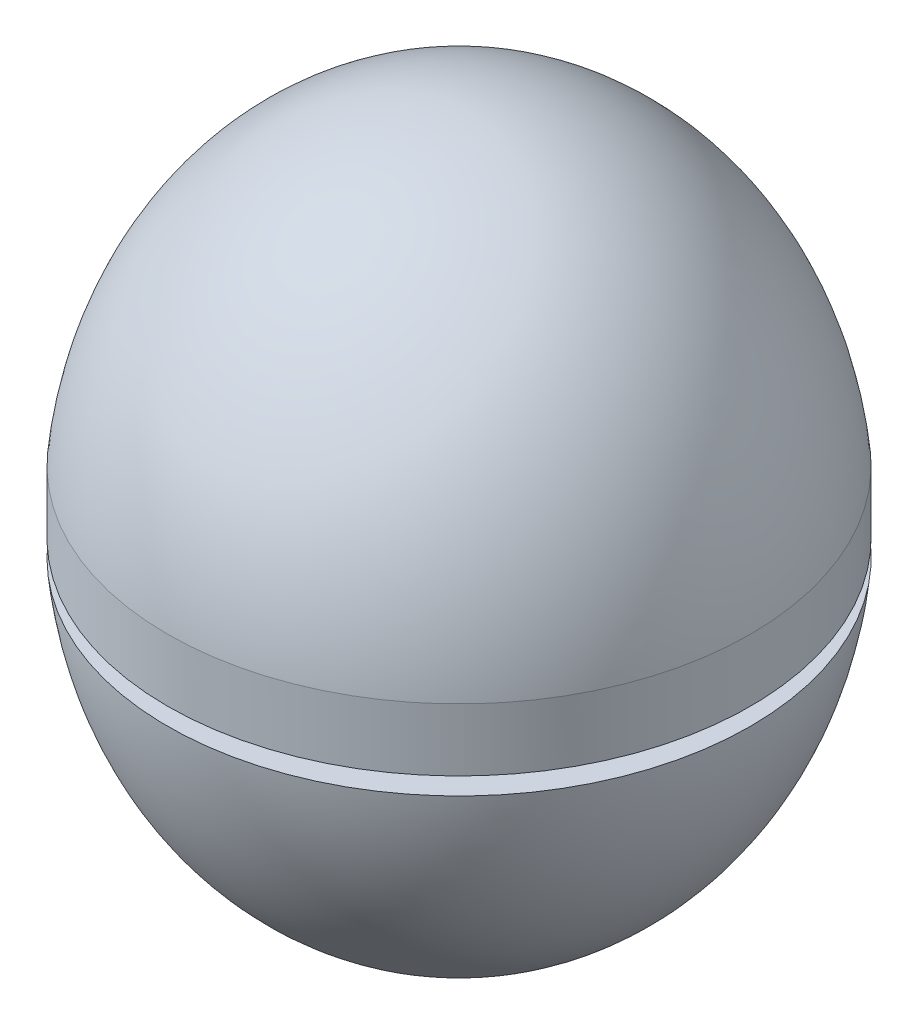
ISO-10303-21;
HEADER;
FILE_DESCRIPTION(('STEP AP214'),'2;1');
FILE_NAME('part.step','',(''),(''),'','','');
FILE_SCHEMA(('AUTOMOTIVE_DESIGN { 1 0 10303 214 1 1 1 1 }'));
ENDSEC;
DATA;
#1=APPLICATION_CONTEXT('core data for automotive mechanical design processes');
#2=APPLICATION_PROTOCOL_DEFINITION('international standard','automotive_design',2000,#1);
#3=PRODUCT_CONTEXT('',#1,'mechanical');
#4=PRODUCT('Part','Part','',(#3));
#5=PRODUCT_RELATED_PRODUCT_CATEGORY('part','',(#4));
#6=PRODUCT_DEFINITION_FORMATION('','',#4);
#7=PRODUCT_DEFINITION_CONTEXT('part definition',#1,'design');
#8=PRODUCT_DEFINITION('design','',#6,#7);
#9=PRODUCT_DEFINITION_SHAPE('','',#8);
#10=(LENGTH_UNIT() NAMED_UNIT(*) SI_UNIT(.MILLI.,.METRE.));
#11=(NAMED_UNIT(*) PLANE_ANGLE_UNIT() SI_UNIT($,.RADIAN.));
#12=(NAMED_UNIT(*) SI_UNIT($,.STERADIAN.) SOLID_ANGLE_UNIT());
#13=UNCERTAINTY_MEASURE_WITH_UNIT(LENGTH_MEASURE(1.E-05),#10,'distance_accuracy_value','');
#14=(GEOMETRIC_REPRESENTATION_CONTEXT(3) GLOBAL_UNCERTAINTY_ASSIGNED_CONTEXT((#13)) GLOBAL_UNIT_ASSIGNED_CONTEXT((#10,
#11,#12)) REPRESENTATION_CONTEXT('',''));
#15=CARTESIAN_POINT('',(0.,0.,0.));
#16=DIRECTION('',(0.,0.,1.));
#17=DIRECTION('',(1.,0.,0.));
#18=AXIS2_PLACEMENT_3D('',#15,#16,#17);
#19=CARTESIAN_POINT('',(-39.751866797119,-2.99999999999997,0.));
#20=DIRECTION('',(0.,-1.,0.));
#21=DIRECTION('',(0.,0.,-1.));
#22=AXIS2_PLACEMENT_3D('',#19,#20,#21);
#23=PLANE('',#22);
#24=CARTESIAN_POINT('',(0.,-2.99999999999997,0.));
#25=DIRECTION('',(0.,-1.,0.));
#26=DIRECTION('',(0.,0.,-1.));
#27=AXIS2_PLACEMENT_3D('',#24,#25,#26);
#28=CIRCLE('',#27,38.7411724744243);
#29=CARTESIAN_POINT('',(0.,-2.99999999999997,-38.7411724744243));
#30=VERTEX_POINT('',#29);
#31=EDGE_CURVE('E57',#30,#30,#28,.F.);
#32=ORIENTED_EDGE('',*,*,#31,.F.);
#33=EDGE_LOOP('',(#32));
#34=FACE_BOUND('',#33,.T.);
#35=CARTESIAN_POINT('',(0.,-2.99999999999997,0.));
#36=DIRECTION('',(0.,1.,0.));
#37=DIRECTION('',(0.,0.,1.));
#38=AXIS2_PLACEMENT_3D('',#35,#36,#37);
#39=CIRCLE('',#38,34.7411724744243);
#40=CARTESIAN_POINT('',(0.,-2.99999999999997,34.7411724744243));
#41=VERTEX_POINT('',#40);
#42=EDGE_CURVE('E62',#41,#41,#39,.T.);
#43=ORIENTED_EDGE('',*,*,#42,.T.);
#44=EDGE_LOOP('',(#43));
#45=FACE_BOUND('',#44,.T.);
#46=ADVANCED_FACE('F54',(#34,#45),#23,.T.);
#47=CARTESIAN_POINT('',(-34.7411724744243,4.24999999999999,0.));
#48=DIRECTION('',(0.,-1.,0.));
#49=DIRECTION('',(0.,0.,-1.));
#50=AXIS2_PLACEMENT_3D('',#47,#48,#49);
#51=PLANE('',#50);
#52=CARTESIAN_POINT('',(0.,4.24999999999999,0.));
#53=DIRECTION('',(0.,1.,0.));
#54=DIRECTION('',(0.,0.,1.));
#55=AXIS2_PLACEMENT_3D('',#52,#53,#54);
#56=CIRCLE('',#55,34.7411724744243);
#57=CARTESIAN_POINT('',(0.,4.24999999999999,34.7411724744243));
#58=VERTEX_POINT('',#57);
#59=EDGE_CURVE('E12',#58,#58,#56,.T.);
#60=ORIENTED_EDGE('',*,*,#59,.F.);
#61=EDGE_LOOP('',(#60));
#62=FACE_BOUND('',#61,.T.);
#63=CARTESIAN_POINT('',(0.,4.24999999999999,0.));
#64=DIRECTION('',(0.,-1.,0.));
#65=DIRECTION('',(0.,0.,-1.));
#66=AXIS2_PLACEMENT_3D('',#63,#64,#65);
#67=CIRCLE('',#66,32.7411724744243);
#68=CARTESIAN_POINT('',(0.,4.24999999999999,-32.7411724744243));
#69=VERTEX_POINT('',#68);
#70=EDGE_CURVE('E112',#69,#69,#67,.F.);
#71=ORIENTED_EDGE('',*,*,#70,.T.);
#72=EDGE_LOOP('',(#71));
#73=FACE_BOUND('',#72,.T.);
#74=ADVANCED_FACE('F75',(#62,#73),#51,.T.);
#75=CARTESIAN_POINT('',(0.,0.,0.));
#76=DIRECTION('',(0.,1.,0.));
#77=DIRECTION('',(0.,0.,1.));
#78=AXIS2_PLACEMENT_3D('',#75,#76,#77);
#79=CYLINDRICAL_SURFACE('',#78,34.7411724744243);
#80=ORIENTED_EDGE('',*,*,#42,.F.);
#81=EDGE_LOOP('',(#80));
#82=FACE_BOUND('',#81,.T.);
#83=ORIENTED_EDGE('',*,*,#59,.T.);
#84=EDGE_LOOP('',(#83));
#85=FACE_BOUND('',#84,.T.);
#86=ADVANCED_FACE('F73',(#82,#85),#79,.F.);
#87=CARTESIAN_POINT('',(0.,0.,0.));
#88=DIRECTION('',(0.,0.,-1.));
#89=DIRECTION('',(0.,1.,0.));
#90=AXIS2_PLACEMENT_3D('',#87,#88,#89);
#91=ELLIPSE('',#90,40.,33.);
#92=TRIMMED_CURVE('',#91,(PARAMETER_VALUE(0.)),(PARAMETER_VALUE(3.14159265358979)),.T.,.PARAMETER.);
#93=CARTESIAN_POINT('',(0.,0.,0.));
#94=DIRECTION('',(0.,1.,0.));
#95=AXIS1_PLACEMENT('',#93,#94);
#96=SURFACE_OF_REVOLUTION('',#92,#95);
#97=CARTESIAN_POINT('',(0.,40.,0.));
#98=VERTEX_POINT('',#97);
#99=VERTEX_LOOP('',#98);
#100=FACE_BOUND('',#99,.T.);
#101=CARTESIAN_POINT('',(0.,4.99999999999999,0.));
#102=DIRECTION('',(0.,1.,0.));
#103=DIRECTION('',(0.,0.,1.));
#104=AXIS2_PLACEMENT_3D('',#101,#102,#103);
#105=CIRCLE('',#104,32.7411724744243);
#106=CARTESIAN_POINT('',(0.,4.99999999999999,32.7411724744243));
#107=VERTEX_POINT('',#106);
#108=EDGE_CURVE('E78',#107,#107,#105,.T.);
#109=ORIENTED_EDGE('',*,*,#108,.F.);
#110=EDGE_LOOP('',(#109));
#111=FACE_BOUND('',#110,.T.);
#112=ADVANCED_FACE('F69',(#100,#111),#96,.T.);
#113=CARTESIAN_POINT('',(0.,0.,0.));
#114=DIRECTION('',(0.,1.,0.));
#115=DIRECTION('',(0.,0.,1.));
#116=AXIS2_PLACEMENT_3D('',#113,#114,#115);
#117=CYLINDRICAL_SURFACE('',#116,32.7411724744243);
#118=ORIENTED_EDGE('',*,*,#70,.F.);
#119=EDGE_LOOP('',(#118));
#120=FACE_BOUND('',#119,.T.);
#121=ORIENTED_EDGE('',*,*,#108,.T.);
#122=EDGE_LOOP('',(#121));
#123=FACE_BOUND('',#122,.T.);
#124=ADVANCED_FACE('F72',(#120,#123),#117,.F.);
#125=CARTESIAN_POINT('',(0.,46.,0.));
#126=CARTESIAN_POINT('',(2.43750808219156,46.,0.));
#127=CARTESIAN_POINT('',(4.87478854043028,45.7305054947189,0.));
#128=CARTESIAN_POINT('',(9.65016139074257,44.6677839082201,0.));
#129=CARTESIAN_POINT('',(11.9879386111832,43.8748285797408,0.));
#130=CARTESIAN_POINT('',(16.4769880292201,41.8071254197173,0.));
#131=CARTESIAN_POINT('',(18.6282067880805,40.5326990588235,0.));
#132=CARTESIAN_POINT('',(22.6748843654917,37.5608628589535,0.));
#133=CARTESIAN_POINT('',(24.5704432487271,35.8636555448346,0.));
#134=CARTESIAN_POINT('',(28.0533745007805,32.1135859269213,0.));
#135=CARTESIAN_POINT('',(29.6408575447832,30.0608033465646,0.));
#136=CARTESIAN_POINT('',(32.4683878550123,25.6712950540091,0.));
#137=CARTESIAN_POINT('',(33.7084976267559,23.3345928727547,0.));
#138=CARTESIAN_POINT('',(35.8124620976494,18.4520544171715,0.));
#139=CARTESIAN_POINT('',(36.676336571535,15.9062360869494,0.));
#140=CARTESIAN_POINT('',(38.0082581384073,10.6829142388074,0.));
#141=CARTESIAN_POINT('',(38.476305103022,8.0054412947938,0.));
#142=CARTESIAN_POINT('',(38.7411724744243,5.30182976688779,0.));
#143=B_SPLINE_CURVE_WITH_KNOTS('',3,(#125,#126,#127,#128,#129,#130,#131,#132,#133,#134,#135,
#136,#137,#138,#139,#140,#141,#142),.UNSPECIFIED.,.F.,.F.,(4,2,2,2,2,2,2,2,4),(0.,0.125,0.25,
0.375,0.5,0.625,0.75,0.875,1.),.UNSPECIFIED.);
#144=CARTESIAN_POINT('',(0.,0.,0.));
#145=DIRECTION('',(0.,1.,0.));
#146=AXIS1_PLACEMENT('',#144,#145);
#147=SURFACE_OF_REVOLUTION('',#143,#146);
#148=CARTESIAN_POINT('',(0.,5.30182976688779,0.));
#149=DIRECTION('',(0.,1.,0.));
#150=DIRECTION('',(0.,0.,1.));
#151=AXIS2_PLACEMENT_3D('',#148,#149,#150);
#152=CIRCLE('',#151,38.7411724744243);
#153=CARTESIAN_POINT('',(0.,5.30182976688779,38.7411724744243));
#154=VERTEX_POINT('',#153);
#155=EDGE_CURVE('E80',#154,#154,#152,.T.);
#156=ORIENTED_EDGE('',*,*,#155,.T.);
#157=EDGE_LOOP('',(#156));
#158=FACE_BOUND('',#157,.T.);
#159=CARTESIAN_POINT('',(0.,46.,0.));
#160=VERTEX_POINT('',#159);
#161=VERTEX_LOOP('',#160);
#162=FACE_BOUND('',#161,.T.);
#163=ADVANCED_FACE('F94',(#158,#162),#147,.F.);
#164=CARTESIAN_POINT('',(0.,0.,0.));
#165=DIRECTION('',(0.,1.,0.));
#166=DIRECTION('',(0.,0.,1.));
#167=AXIS2_PLACEMENT_3D('',#164,#165,#166);
#168=CYLINDRICAL_SURFACE('',#167,38.7411724744243);
#169=ORIENTED_EDGE('',*,*,#155,.F.);
#170=EDGE_LOOP('',(#169));
#171=FACE_BOUND('',#170,.T.);
#172=ORIENTED_EDGE('',*,*,#31,.T.);
#173=EDGE_LOOP('',(#172));
#174=FACE_BOUND('',#173,.T.);
#175=ADVANCED_FACE('F98',(#171,#174),#168,.T.);
#176=CLOSED_SHELL('',(#46,#74,#86,#112,#124,#163,#175));
#177=MANIFOLD_SOLID_BREP('B2',#176);
#178=CARTESIAN_POINT('',(-34.7411724744243,4.24999999999999,0.));
#179=DIRECTION('',(0.,-1.,0.));
#180=DIRECTION('',(0.,0.,-1.));
#181=AXIS2_PLACEMENT_3D('',#178,#179,#180);
#182=PLANE('',#181);
#183=CARTESIAN_POINT('',(0.,4.24999999999999,0.));
#184=DIRECTION('',(0.,-1.,0.));
#185=DIRECTION('',(0.,0.,-1.));
#186=AXIS2_PLACEMENT_3D('',#183,#184,#185);
#187=CIRCLE('',#186,32.7411724744243);
#188=CARTESIAN_POINT('',(0.,4.24999999999999,-32.7411724744243));
#189=VERTEX_POINT('',#188);
#190=EDGE_CURVE('E194',#189,#189,#187,.F.);
#191=ORIENTED_EDGE('',*,*,#190,.F.);
#192=EDGE_LOOP('',(#191));
#193=FACE_BOUND('',#192,.T.);
#194=CARTESIAN_POINT('',(0.,4.24999999999999,0.));
#195=DIRECTION('',(0.,1.,0.));
#196=DIRECTION('',(0.,0.,1.));
#197=AXIS2_PLACEMENT_3D('',#194,#195,#196);
#198=CIRCLE('',#197,34.7411724744243);
#199=CARTESIAN_POINT('',(0.,4.24999999999999,34.7411724744243));
#200=VERTEX_POINT('',#199);
#201=EDGE_CURVE('E190',#200,#200,#198,.T.);
#202=ORIENTED_EDGE('',*,*,#201,.T.);
#203=EDGE_LOOP('',(#202));
#204=FACE_BOUND('',#203,.T.);
#205=ADVANCED_FACE('F185',(#193,#204),#182,.F.);
#206=CARTESIAN_POINT('',(0.,0.,0.));
#207=DIRECTION('',(0.,1.,0.));
#208=DIRECTION('',(0.,0.,1.));
#209=AXIS2_PLACEMENT_3D('',#206,#207,#208);
#210=CYLINDRICAL_SURFACE('',#209,34.7411724744243);
#211=ORIENTED_EDGE('',*,*,#201,.F.);
#212=EDGE_LOOP('',(#211));
#213=FACE_BOUND('',#212,.T.);
#214=CARTESIAN_POINT('',(0.,-5.30182976688777,0.));
#215=DIRECTION('',(0.,-1.,0.));
#216=DIRECTION('',(0.,0.,-1.));
#217=AXIS2_PLACEMENT_3D('',#214,#215,#216);
#218=CIRCLE('',#217,34.7411724744243);
#219=CARTESIAN_POINT('',(0.,-5.30182976688777,-34.7411724744243));
#220=VERTEX_POINT('',#219);
#221=EDGE_CURVE('E239',#220,#220,#218,.F.);
#222=ORIENTED_EDGE('',*,*,#221,.T.);
#223=EDGE_LOOP('',(#222));
#224=FACE_BOUND('',#223,.T.);
#225=ADVANCED_FACE('F205',(#213,#224),#210,.T.);
#226=CARTESIAN_POINT('',(0.,0.,0.));
#227=DIRECTION('',(0.,1.,0.));
#228=DIRECTION('',(0.,0.,1.));
#229=AXIS2_PLACEMENT_3D('',#226,#227,#228);
#230=CYLINDRICAL_SURFACE('',#229,32.7411724744243);
#231=CARTESIAN_POINT('',(0.,-4.99999999999997,0.));
#232=DIRECTION('',(0.,1.,0.));
#233=DIRECTION('',(0.,0.,1.));
#234=AXIS2_PLACEMENT_3D('',#231,#232,#233);
#235=CIRCLE('',#234,32.7411724744243);
#236=CARTESIAN_POINT('',(0.,-4.99999999999997,32.7411724744243));
#237=VERTEX_POINT('',#236);
#238=EDGE_CURVE('E52',#237,#237,#235,.T.);
#239=ORIENTED_EDGE('',*,*,#238,.F.);
#240=EDGE_LOOP('',(#239));
#241=FACE_BOUND('',#240,.T.);
#242=ORIENTED_EDGE('',*,*,#190,.T.);
#243=EDGE_LOOP('',(#242));
#244=FACE_BOUND('',#243,.T.);
#245=ADVANCED_FACE('F203',(#241,#244),#230,.F.);
#246=CARTESIAN_POINT('',(0.,0.,0.));
#247=DIRECTION('',(0.,0.,-1.));
#248=DIRECTION('',(0.,1.,0.));
#249=AXIS2_PLACEMENT_3D('',#246,#247,#248);
#250=ELLIPSE('',#249,40.,33.);
#251=TRIMMED_CURVE('',#250,(PARAMETER_VALUE(0.)),(PARAMETER_VALUE(3.14159265358979)),.T.,.PARAMETER.);
#252=CARTESIAN_POINT('',(0.,0.,0.));
#253=DIRECTION('',(0.,1.,0.));
#254=AXIS1_PLACEMENT('',#252,#253);
#255=SURFACE_OF_REVOLUTION('',#251,#254);
#256=ORIENTED_EDGE('',*,*,#238,.T.);
#257=EDGE_LOOP('',(#256));
#258=FACE_BOUND('',#257,.T.);
#259=CARTESIAN_POINT('',(0.,-40.,0.));
#260=VERTEX_POINT('',#259);
#261=VERTEX_LOOP('',#260);
#262=FACE_BOUND('',#261,.T.);
#263=ADVANCED_FACE('F187',(#258,#262),#255,.T.);
#264=CARTESIAN_POINT('',(0.,-5.30182976688777,0.));
#265=DIRECTION('',(0.,-1.,0.));
#266=DIRECTION('',(0.,0.,-1.));
#267=AXIS2_PLACEMENT_3D('',#264,#265,#266);
#268=PLANE('',#267);
#269=CARTESIAN_POINT('',(0.,-5.30182976688777,0.));
#270=DIRECTION('',(0.,-1.,0.));
#271=DIRECTION('',(0.,0.,-1.));
#272=AXIS2_PLACEMENT_3D('',#269,#270,#271);
#273=CIRCLE('',#272,38.7411724744243);
#274=CARTESIAN_POINT('',(0.,-5.30182976688777,-38.7411724744243));
#275=VERTEX_POINT('',#274);
#276=EDGE_CURVE('E242',#275,#275,#273,.F.);
#277=ORIENTED_EDGE('',*,*,#276,.T.);
#278=EDGE_LOOP('',(#277));
#279=FACE_BOUND('',#278,.T.);
#280=ORIENTED_EDGE('',*,*,#221,.F.);
#281=EDGE_LOOP('',(#280));
#282=FACE_BOUND('',#281,.T.);
#283=ADVANCED_FACE('F202',(#279,#282),#268,.F.);
#284=CARTESIAN_POINT('',(38.7411724744243,-5.30182976688778,0.));
#285=CARTESIAN_POINT('',(38.476305103022,-8.00544129479378,0.));
#286=CARTESIAN_POINT('',(38.0082581384073,-10.6829142388074,0.));
#287=CARTESIAN_POINT('',(36.676336571535,-15.9062360869494,0.));
#288=CARTESIAN_POINT('',(35.8124620976494,-18.4520544171714,0.));
#289=CARTESIAN_POINT('',(33.7084976267559,-23.3345928727547,0.));
#290=CARTESIAN_POINT('',(32.4683878550123,-25.6712950540091,0.));
#291=CARTESIAN_POINT('',(29.6408575447833,-30.0608033465646,0.));
#292=CARTESIAN_POINT('',(28.0533745007805,-32.1135859269213,0.));
#293=CARTESIAN_POINT('',(24.5704432487272,-35.8636555448346,0.));
#294=CARTESIAN_POINT('',(22.6748843654917,-37.5608628589535,0.));
#295=CARTESIAN_POINT('',(18.6282067880805,-40.5326990588235,0.));
#296=CARTESIAN_POINT('',(16.4769880292201,-41.8071254197173,0.));
#297=CARTESIAN_POINT('',(11.9879386111832,-43.8748285797408,0.));
#298=CARTESIAN_POINT('',(9.6501613907426,-44.6677839082201,0.));
#299=CARTESIAN_POINT('',(4.8747885404303,-45.7305054947189,0.));
#300=CARTESIAN_POINT('',(2.43750808219157,-46.,0.));
#301=CARTESIAN_POINT('',(0.,-46.,0.));
#302=B_SPLINE_CURVE_WITH_KNOTS('',3,(#284,#285,#286,#287,#288,#289,#290,#291,#292,#293,#294,
#295,#296,#297,#298,#299,#300,#301),.UNSPECIFIED.,.F.,.F.,(4,2,2,2,2,2,2,2,4),(0.,0.125,0.25,
0.375,0.5,0.625,0.75,0.875,1.),.UNSPECIFIED.);
#303=CARTESIAN_POINT('',(0.,0.,0.));
#304=DIRECTION('',(0.,1.,0.));
#305=AXIS1_PLACEMENT('',#303,#304);
#306=SURFACE_OF_REVOLUTION('',#302,#305);
#307=CARTESIAN_POINT('',(0.,-46.,0.));
#308=VERTEX_POINT('',#307);
#309=VERTEX_LOOP('',#308);
#310=FACE_BOUND('',#309,.T.);
#311=ORIENTED_EDGE('',*,*,#276,.F.);
#312=EDGE_LOOP('',(#311));
#313=FACE_BOUND('',#312,.T.);
#314=ADVANCED_FACE('F210',(#310,#313),#306,.F.);
#315=CLOSED_SHELL('',(#205,#225,#245,#263,#283,#314));
#316=MANIFOLD_SOLID_BREP('B6',#315);
#317=ADVANCED_BREP_SHAPE_REPRESENTATION('',(#18,#177,#316),#14);
#318=SHAPE_DEFINITION_REPRESENTATION(#9,#317);
ENDSEC;
END-ISO-10303-21;
